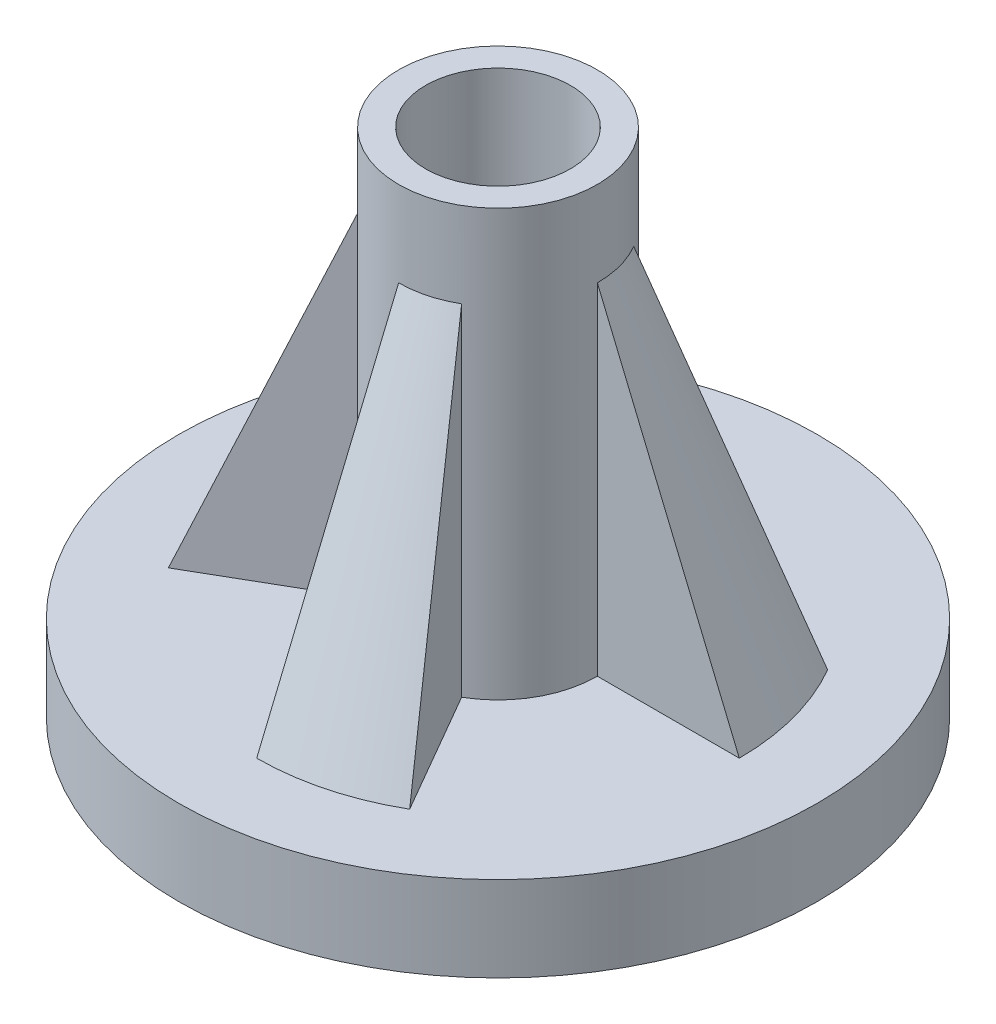
ISO-10303-21;
HEADER;
FILE_DESCRIPTION(('STEP AP214'),'2;1');
FILE_NAME('part.step','',(''),(''),'','','');
FILE_SCHEMA(('AUTOMOTIVE_DESIGN { 1 0 10303 214 1 1 1 1 }'));
ENDSEC;
DATA;
#1=APPLICATION_CONTEXT('core data for automotive mechanical design processes');
#2=APPLICATION_PROTOCOL_DEFINITION('international standard','automotive_design',2000,#1);
#3=PRODUCT_CONTEXT('',#1,'mechanical');
#4=PRODUCT('Part','Part','',(#3));
#5=PRODUCT_RELATED_PRODUCT_CATEGORY('part','',(#4));
#6=PRODUCT_DEFINITION_FORMATION('','',#4);
#7=PRODUCT_DEFINITION_CONTEXT('part definition',#1,'design');
#8=PRODUCT_DEFINITION('design','',#6,#7);
#9=PRODUCT_DEFINITION_SHAPE('','',#8);
#10=(LENGTH_UNIT() NAMED_UNIT(*) SI_UNIT(.MILLI.,.METRE.));
#11=(NAMED_UNIT(*) PLANE_ANGLE_UNIT() SI_UNIT($,.RADIAN.));
#12=(NAMED_UNIT(*) SI_UNIT($,.STERADIAN.) SOLID_ANGLE_UNIT());
#13=UNCERTAINTY_MEASURE_WITH_UNIT(LENGTH_MEASURE(1.E-05),#10,'distance_accuracy_value','');
#14=(GEOMETRIC_REPRESENTATION_CONTEXT(3) GLOBAL_UNCERTAINTY_ASSIGNED_CONTEXT((#13)) GLOBAL_UNIT_ASSIGNED_CONTEXT((#10,
#11,#12)) REPRESENTATION_CONTEXT('',''));
#15=CARTESIAN_POINT('',(0.,0.,0.));
#16=DIRECTION('',(0.,0.,1.));
#17=DIRECTION('',(1.,0.,0.));
#18=AXIS2_PLACEMENT_3D('',#15,#16,#17);
#19=CARTESIAN_POINT('',(0.,4.8,0.));
#20=DIRECTION('',(0.,1.,0.));
#21=DIRECTION('',(0.,0.,1.));
#22=AXIS2_PLACEMENT_3D('',#19,#20,#21);
#23=PLANE('',#22);
#24=CARTESIAN_POINT('',(0.,4.8,0.));
#25=DIRECTION('',(0.,1.,0.));
#26=DIRECTION('',(0.,0.,1.));
#27=AXIS2_PLACEMENT_3D('',#24,#25,#26);
#28=CIRCLE('',#27,11.25);
#29=CARTESIAN_POINT('',(0.,4.8,11.25));
#30=VERTEX_POINT('',#29);
#31=EDGE_CURVE('E55',#30,#30,#28,.T.);
#32=ORIENTED_EDGE('',*,*,#31,.T.);
#33=EDGE_LOOP('',(#32));
#34=FACE_BOUND('',#33,.T.);
#35=CARTESIAN_POINT('',(0.,4.8,0.));
#36=DIRECTION('',(0.,1.,0.));
#37=DIRECTION('',(0.,0.,1.));
#38=AXIS2_PLACEMENT_3D('',#35,#36,#37);
#39=CIRCLE('',#38,3.5);
#40=CARTESIAN_POINT('',(3.03108891324553,4.8,-1.75));
#41=VERTEX_POINT('',#40);
#42=CARTESIAN_POINT('',(0.,4.8,-3.5));
#43=VERTEX_POINT('',#42);
#44=EDGE_CURVE('E160',#41,#43,#39,.T.);
#45=ORIENTED_EDGE('',*,*,#44,.F.);
#46=DIRECTION('',(0.866025403784438,0.,-0.500000000000001));
#47=VECTOR('',#46,1.);
#48=CARTESIAN_POINT('',(3.03108891324553,4.8,-1.75));
#49=LINE('',#48,#47);
#50=CARTESIAN_POINT('',(7.36121593216772,4.8,-4.25000000000001));
#51=VERTEX_POINT('',#50);
#52=EDGE_CURVE('E394',#41,#51,#49,.T.);
#53=ORIENTED_EDGE('',*,*,#52,.T.);
#54=CARTESIAN_POINT('',(0.,4.8,0.));
#55=DIRECTION('',(0.,-1.,0.));
#56=DIRECTION('',(0.,0.,-1.));
#57=AXIS2_PLACEMENT_3D('',#54,#55,#56);
#58=CIRCLE('',#57,8.5);
#59=CARTESIAN_POINT('',(8.5,4.8,0.));
#60=VERTEX_POINT('',#59);
#61=EDGE_CURVE('E153',#51,#60,#58,.T.);
#62=ORIENTED_EDGE('',*,*,#61,.T.);
#63=DIRECTION('',(1.,0.,0.));
#64=VECTOR('',#63,1.);
#65=CARTESIAN_POINT('',(3.5,4.8,0.));
#66=LINE('',#65,#64);
#67=CARTESIAN_POINT('',(3.5,4.8,0.));
#68=VERTEX_POINT('',#67);
#69=EDGE_CURVE('E138',#68,#60,#66,.T.);
#70=ORIENTED_EDGE('',*,*,#69,.F.);
#71=CARTESIAN_POINT('',(1.75,4.8,3.03108891324553));
#72=VERTEX_POINT('',#71);
#73=EDGE_CURVE('E150',#72,#68,#39,.T.);
#74=ORIENTED_EDGE('',*,*,#73,.F.);
#75=DIRECTION('',(-0.500000000000001,0.,-0.866025403784438));
#76=VECTOR('',#75,1.);
#77=CARTESIAN_POINT('',(0.,4.8,0.));
#78=LINE('',#77,#76);
#79=CARTESIAN_POINT('',(4.25000000000001,4.8,7.36121593216772));
#80=VERTEX_POINT('',#79);
#81=EDGE_CURVE('E444',#80,#72,#78,.T.);
#82=ORIENTED_EDGE('',*,*,#81,.F.);
#83=CARTESIAN_POINT('',(0.,4.8,0.));
#84=DIRECTION('',(0.,-1.,0.));
#85=DIRECTION('',(0.,0.,-1.));
#86=AXIS2_PLACEMENT_3D('',#83,#84,#85);
#87=CIRCLE('',#86,8.5);
#88=CARTESIAN_POINT('',(0.,4.8,8.5));
#89=VERTEX_POINT('',#88);
#90=EDGE_CURVE('E449',#80,#89,#87,.T.);
#91=ORIENTED_EDGE('',*,*,#90,.T.);
#92=DIRECTION('',(0.,0.,-1.));
#93=VECTOR('',#92,1.);
#94=CARTESIAN_POINT('',(0.,4.8,0.));
#95=LINE('',#94,#93);
#96=CARTESIAN_POINT('',(0.,4.8,3.5));
#97=VERTEX_POINT('',#96);
#98=EDGE_CURVE('E399',#89,#97,#95,.T.);
#99=ORIENTED_EDGE('',*,*,#98,.T.);
#100=CARTESIAN_POINT('',(-3.03108891324553,4.8,1.75));
#101=VERTEX_POINT('',#100);
#102=EDGE_CURVE('E163',#101,#97,#39,.T.);
#103=ORIENTED_EDGE('',*,*,#102,.F.);
#104=DIRECTION('',(0.866025403784438,0.,-0.500000000000001));
#105=VECTOR('',#104,1.);
#106=CARTESIAN_POINT('',(-3.03108891324553,4.8,1.75));
#107=LINE('',#106,#105);
#108=CARTESIAN_POINT('',(-7.36121593216772,4.8,4.25000000000001));
#109=VERTEX_POINT('',#108);
#110=EDGE_CURVE('E62',#109,#101,#107,.T.);
#111=ORIENTED_EDGE('',*,*,#110,.F.);
#112=CARTESIAN_POINT('',(0.,4.8,0.));
#113=DIRECTION('',(0.,-1.,0.));
#114=DIRECTION('',(0.,0.,-1.));
#115=AXIS2_PLACEMENT_3D('',#112,#113,#114);
#116=CIRCLE('',#115,8.5);
#117=CARTESIAN_POINT('',(-8.5,4.8,0.));
#118=VERTEX_POINT('',#117);
#119=EDGE_CURVE('E66',#109,#118,#116,.T.);
#120=ORIENTED_EDGE('',*,*,#119,.T.);
#121=DIRECTION('',(1.,0.,0.));
#122=VECTOR('',#121,1.);
#123=CARTESIAN_POINT('',(-3.5,4.8,0.));
#124=LINE('',#123,#122);
#125=CARTESIAN_POINT('',(-3.5,4.8,0.));
#126=VERTEX_POINT('',#125);
#127=EDGE_CURVE('E403',#118,#126,#124,.T.);
#128=ORIENTED_EDGE('',*,*,#127,.T.);
#129=CARTESIAN_POINT('',(-1.75,4.8,-3.03108891324553));
#130=VERTEX_POINT('',#129);
#131=EDGE_CURVE('E162',#130,#126,#39,.T.);
#132=ORIENTED_EDGE('',*,*,#131,.F.);
#133=DIRECTION('',(0.500000000000001,0.,0.866025403784438));
#134=VECTOR('',#133,1.);
#135=CARTESIAN_POINT('',(0.,4.8,0.));
#136=LINE('',#135,#134);
#137=CARTESIAN_POINT('',(-4.25000000000001,4.8,-7.36121593216772));
#138=VERTEX_POINT('',#137);
#139=EDGE_CURVE('E431',#138,#130,#136,.T.);
#140=ORIENTED_EDGE('',*,*,#139,.F.);
#141=CARTESIAN_POINT('',(0.,4.8,0.));
#142=DIRECTION('',(0.,-1.,0.));
#143=DIRECTION('',(0.,0.,-1.));
#144=AXIS2_PLACEMENT_3D('',#141,#142,#143);
#145=CIRCLE('',#144,8.5);
#146=CARTESIAN_POINT('',(0.,4.8,-8.5));
#147=VERTEX_POINT('',#146);
#148=EDGE_CURVE('E172',#138,#147,#145,.T.);
#149=ORIENTED_EDGE('',*,*,#148,.T.);
#150=DIRECTION('',(0.,0.,1.));
#151=VECTOR('',#150,1.);
#152=CARTESIAN_POINT('',(0.,4.8,0.));
#153=LINE('',#152,#151);
#154=EDGE_CURVE('E423',#147,#43,#153,.T.);
#155=ORIENTED_EDGE('',*,*,#154,.T.);
#156=EDGE_LOOP('',(#45,#53,#62,#70,#74,#82,#91,#99,#103,#111,#120,#128,#132,#140,#149,#155));
#157=FACE_BOUND('',#156,.T.);
#158=ADVANCED_FACE('F46',(#34,#157),#23,.T.);
#159=CARTESIAN_POINT('',(0.,19.8,0.));
#160=DIRECTION('',(0.,-1.,0.));
#161=DIRECTION('',(0.,0.,-1.));
#162=AXIS2_PLACEMENT_3D('',#159,#160,#161);
#163=CYLINDRICAL_SURFACE('',#162,3.5);
#164=CARTESIAN_POINT('',(0.,19.8,0.));
#165=DIRECTION('',(0.,1.,0.));
#166=DIRECTION('',(0.,0.,1.));
#167=AXIS2_PLACEMENT_3D('',#164,#165,#166);
#168=CIRCLE('',#167,3.5);
#169=CARTESIAN_POINT('',(0.,19.8,3.5));
#170=VERTEX_POINT('',#169);
#171=EDGE_CURVE('E165',#170,#170,#168,.T.);
#172=ORIENTED_EDGE('',*,*,#171,.F.);
#173=EDGE_LOOP('',(#172));
#174=FACE_BOUND('',#173,.T.);
#175=DIRECTION('',(0.,-1.,0.));
#176=VECTOR('',#175,1.);
#177=CARTESIAN_POINT('',(3.03108891324553,16.8,-1.75));
#178=LINE('',#177,#176);
#179=CARTESIAN_POINT('',(3.03108891324553,16.8,-1.75));
#180=VERTEX_POINT('',#179);
#181=EDGE_CURVE('E391',#180,#41,#178,.T.);
#182=ORIENTED_EDGE('',*,*,#181,.T.);
#183=ORIENTED_EDGE('',*,*,#44,.T.);
#184=DIRECTION('',(0.,1.,0.));
#185=VECTOR('',#184,1.);
#186=CARTESIAN_POINT('',(0.,0.,-3.5));
#187=LINE('',#186,#185);
#188=CARTESIAN_POINT('',(0.,16.8,-3.5));
#189=VERTEX_POINT('',#188);
#190=EDGE_CURVE('E420',#43,#189,#187,.T.);
#191=ORIENTED_EDGE('',*,*,#190,.T.);
#192=CARTESIAN_POINT('',(0.,16.8,0.));
#193=DIRECTION('',(0.,-1.,0.));
#194=DIRECTION('',(0.,0.,-1.));
#195=AXIS2_PLACEMENT_3D('',#192,#193,#194);
#196=CIRCLE('',#195,3.5);
#197=CARTESIAN_POINT('',(-1.75,16.8,-3.03108891324553));
#198=VERTEX_POINT('',#197);
#199=EDGE_CURVE('E177',#198,#189,#196,.T.);
#200=ORIENTED_EDGE('',*,*,#199,.F.);
#201=DIRECTION('',(0.,1.,0.));
#202=VECTOR('',#201,1.);
#203=CARTESIAN_POINT('',(-1.75,0.,-3.03108891324553));
#204=LINE('',#203,#202);
#205=EDGE_CURVE('E429',#130,#198,#204,.T.);
#206=ORIENTED_EDGE('',*,*,#205,.F.);
#207=ORIENTED_EDGE('',*,*,#131,.T.);
#208=DIRECTION('',(0.,1.,0.));
#209=VECTOR('',#208,1.);
#210=CARTESIAN_POINT('',(-3.5,16.8,0.));
#211=LINE('',#210,#209);
#212=CARTESIAN_POINT('',(-3.5,16.8,0.));
#213=VERTEX_POINT('',#212);
#214=EDGE_CURVE('E405',#126,#213,#211,.T.);
#215=ORIENTED_EDGE('',*,*,#214,.T.);
#216=CARTESIAN_POINT('',(0.,16.8,0.));
#217=DIRECTION('',(0.,-1.,0.));
#218=DIRECTION('',(0.,0.,-1.));
#219=AXIS2_PLACEMENT_3D('',#216,#217,#218);
#220=CIRCLE('',#219,3.5);
#221=CARTESIAN_POINT('',(-3.03108891324553,16.8,1.75));
#222=VERTEX_POINT('',#221);
#223=EDGE_CURVE('E145',#222,#213,#220,.T.);
#224=ORIENTED_EDGE('',*,*,#223,.F.);
#225=DIRECTION('',(0.,1.,0.));
#226=VECTOR('',#225,1.);
#227=CARTESIAN_POINT('',(-3.03108891324553,16.8,1.75));
#228=LINE('',#227,#226);
#229=EDGE_CURVE('E411',#101,#222,#228,.T.);
#230=ORIENTED_EDGE('',*,*,#229,.F.);
#231=ORIENTED_EDGE('',*,*,#102,.T.);
#232=DIRECTION('',(0.,1.,0.));
#233=VECTOR('',#232,1.);
#234=CARTESIAN_POINT('',(0.,0.,3.5));
#235=LINE('',#234,#233);
#236=CARTESIAN_POINT('',(0.,16.8,3.5));
#237=VERTEX_POINT('',#236);
#238=EDGE_CURVE('E439',#97,#237,#235,.T.);
#239=ORIENTED_EDGE('',*,*,#238,.T.);
#240=CARTESIAN_POINT('',(0.,16.8,0.));
#241=DIRECTION('',(0.,-1.,0.));
#242=DIRECTION('',(0.,0.,-1.));
#243=AXIS2_PLACEMENT_3D('',#240,#241,#242);
#244=CIRCLE('',#243,3.5);
#245=CARTESIAN_POINT('',(1.75,16.8,3.03108891324553));
#246=VERTEX_POINT('',#245);
#247=EDGE_CURVE('E180',#246,#237,#244,.T.);
#248=ORIENTED_EDGE('',*,*,#247,.F.);
#249=DIRECTION('',(0.,1.,0.));
#250=VECTOR('',#249,1.);
#251=CARTESIAN_POINT('',(1.75,0.,3.03108891324553));
#252=LINE('',#251,#250);
#253=EDGE_CURVE('E158',#72,#246,#252,.T.);
#254=ORIENTED_EDGE('',*,*,#253,.F.);
#255=ORIENTED_EDGE('',*,*,#73,.T.);
#256=DIRECTION('',(0.,-1.,0.));
#257=VECTOR('',#256,1.);
#258=CARTESIAN_POINT('',(3.5,16.8,0.));
#259=LINE('',#258,#257);
#260=CARTESIAN_POINT('',(3.5,16.8,0.));
#261=VERTEX_POINT('',#260);
#262=EDGE_CURVE('E135',#261,#68,#259,.T.);
#263=ORIENTED_EDGE('',*,*,#262,.F.);
#264=CARTESIAN_POINT('',(0.,16.8,0.));
#265=DIRECTION('',(0.,-1.,0.));
#266=DIRECTION('',(0.,0.,-1.));
#267=AXIS2_PLACEMENT_3D('',#264,#265,#266);
#268=CIRCLE('',#267,3.5);
#269=EDGE_CURVE('E396',#180,#261,#268,.T.);
#270=ORIENTED_EDGE('',*,*,#269,.F.);
#271=EDGE_LOOP('',(#182,#183,#191,#200,#206,#207,#215,#224,#230,#231,#239,#248,#254,#255,#263,#270));
#272=FACE_BOUND('',#271,.T.);
#273=ADVANCED_FACE('F156',(#174,#272),#163,.T.);
#274=CARTESIAN_POINT('',(0.,4.8,0.));
#275=DIRECTION('',(0.,-1.,0.));
#276=DIRECTION('',(0.,0.,-1.));
#277=AXIS2_PLACEMENT_3D('',#274,#275,#276);
#278=CYLINDRICAL_SURFACE('',#277,11.25);
#279=ORIENTED_EDGE('',*,*,#31,.F.);
#280=EDGE_LOOP('',(#279));
#281=FACE_BOUND('',#280,.T.);
#282=CARTESIAN_POINT('',(0.,1.8,0.));
#283=DIRECTION('',(0.,1.,0.));
#284=DIRECTION('',(0.,0.,1.));
#285=AXIS2_PLACEMENT_3D('',#282,#283,#284);
#286=CIRCLE('',#285,11.25);
#287=CARTESIAN_POINT('',(0.,1.8,11.25));
#288=VERTEX_POINT('',#287);
#289=EDGE_CURVE('E183',#288,#288,#286,.T.);
#290=ORIENTED_EDGE('',*,*,#289,.T.);
#291=EDGE_LOOP('',(#290));
#292=FACE_BOUND('',#291,.T.);
#293=ADVANCED_FACE('F48',(#281,#292),#278,.T.);
#294=CARTESIAN_POINT('',(0.,1.8,0.));
#295=DIRECTION('',(0.,1.,0.));
#296=DIRECTION('',(0.,0.,1.));
#297=AXIS2_PLACEMENT_3D('',#294,#295,#296);
#298=PLANE('',#297);
#299=ORIENTED_EDGE('',*,*,#289,.F.);
#300=EDGE_LOOP('',(#299));
#301=FACE_BOUND('',#300,.T.);
#302=CARTESIAN_POINT('',(0.,1.8,0.));
#303=DIRECTION('',(0.,1.,0.));
#304=DIRECTION('',(0.,0.,1.));
#305=AXIS2_PLACEMENT_3D('',#302,#303,#304);
#306=CIRCLE('',#305,1.5);
#307=CARTESIAN_POINT('',(0.,1.8,1.5));
#308=VERTEX_POINT('',#307);
#309=EDGE_CURVE('E50',#308,#308,#306,.F.);
#310=ORIENTED_EDGE('',*,*,#309,.F.);
#311=EDGE_LOOP('',(#310));
#312=FACE_BOUND('',#311,.T.);
#313=ADVANCED_FACE('F195',(#301,#312),#298,.F.);
#314=CARTESIAN_POINT('',(0.,19.8,0.));
#315=DIRECTION('',(0.,-1.,0.));
#316=DIRECTION('',(0.,0.,-1.));
#317=AXIS2_PLACEMENT_3D('',#314,#315,#316);
#318=CYLINDRICAL_SURFACE('',#317,2.55);
#319=CARTESIAN_POINT('',(0.,19.8,0.));
#320=DIRECTION('',(0.,1.,0.));
#321=DIRECTION('',(0.,0.,1.));
#322=AXIS2_PLACEMENT_3D('',#319,#320,#321);
#323=CIRCLE('',#322,2.55);
#324=CARTESIAN_POINT('',(0.,19.8,2.55));
#325=VERTEX_POINT('',#324);
#326=EDGE_CURVE('E159',#325,#325,#323,.T.);
#327=ORIENTED_EDGE('',*,*,#326,.T.);
#328=EDGE_LOOP('',(#327));
#329=FACE_BOUND('',#328,.T.);
#330=CARTESIAN_POINT('',(0.,4.8,0.));
#331=DIRECTION('',(0.,1.,0.));
#332=DIRECTION('',(0.,0.,1.));
#333=AXIS2_PLACEMENT_3D('',#330,#331,#332);
#334=CIRCLE('',#333,2.55);
#335=CARTESIAN_POINT('',(0.,4.8,2.55));
#336=VERTEX_POINT('',#335);
#337=EDGE_CURVE('E11',#336,#336,#334,.F.);
#338=ORIENTED_EDGE('',*,*,#337,.T.);
#339=EDGE_LOOP('',(#338));
#340=FACE_BOUND('',#339,.T.);
#341=ADVANCED_FACE('F200',(#329,#340),#318,.F.);
#342=CARTESIAN_POINT('',(0.,19.8,0.));
#343=DIRECTION('',(0.,1.,0.));
#344=DIRECTION('',(0.,0.,1.));
#345=AXIS2_PLACEMENT_3D('',#342,#343,#344);
#346=PLANE('',#345);
#347=ORIENTED_EDGE('',*,*,#326,.F.);
#348=EDGE_LOOP('',(#347));
#349=FACE_BOUND('',#348,.T.);
#350=ORIENTED_EDGE('',*,*,#171,.T.);
#351=EDGE_LOOP('',(#350));
#352=FACE_BOUND('',#351,.T.);
#353=ADVANCED_FACE('F214',(#349,#352),#346,.T.);
#354=CARTESIAN_POINT('',(0.,4.8,0.));
#355=DIRECTION('',(0.,1.,0.));
#356=DIRECTION('',(0.,0.,1.));
#357=AXIS2_PLACEMENT_3D('',#354,#355,#356);
#358=CIRCLE('',#357,1.5);
#359=CARTESIAN_POINT('',(0.,4.8,1.5));
#360=VERTEX_POINT('',#359);
#361=EDGE_CURVE('E169',#360,#360,#358,.T.);
#362=ORIENTED_EDGE('',*,*,#361,.F.);
#363=EDGE_LOOP('',(#362));
#364=FACE_BOUND('',#363,.T.);
#365=ORIENTED_EDGE('',*,*,#337,.F.);
#366=EDGE_LOOP('',(#365));
#367=FACE_BOUND('',#366,.T.);
#368=ADVANCED_FACE('F207',(#364,#367),#23,.T.);
#369=CARTESIAN_POINT('',(0.,-4.24264068711929,0.));
#370=DIRECTION('',(0.,1.,0.));
#371=DIRECTION('',(0.,0.,1.));
#372=AXIS2_PLACEMENT_3D('',#369,#370,#371);
#373=CYLINDRICAL_SURFACE('',#372,1.5);
#374=ORIENTED_EDGE('',*,*,#309,.T.);
#375=EDGE_LOOP('',(#374));
#376=FACE_BOUND('',#375,.T.);
#377=ORIENTED_EDGE('',*,*,#361,.T.);
#378=EDGE_LOOP('',(#377));
#379=FACE_BOUND('',#378,.T.);
#380=ADVANCED_FACE('F213',(#376,#379),#373,.F.);
#381=CARTESIAN_POINT('',(0.,16.8,0.));
#382=DIRECTION('',(0.,-1.,0.));
#383=DIRECTION('',(0.,0.,-1.));
#384=AXIS2_PLACEMENT_3D('',#381,#382,#383);
#385=CONICAL_SURFACE('',#384,3.5,0.394791119699761);
#386=DIRECTION('',(0.192307692307693,-0.923076923076923,0.333086693763245));
#387=VECTOR('',#386,1.);
#388=CARTESIAN_POINT('',(4.4733727810651,3.72781065088757,7.74810893800042));
#389=LINE('',#388,#387);
#390=EDGE_CURVE('E447',#246,#80,#389,.T.);
#391=ORIENTED_EDGE('',*,*,#390,.F.);
#392=ORIENTED_EDGE('',*,*,#247,.T.);
#393=DIRECTION('',(0.,-0.923076923076923,0.384615384615385));
#394=VECTOR('',#393,1.);
#395=CARTESIAN_POINT('',(0.,3.72781065088757,8.94674556213018));
#396=LINE('',#395,#394);
#397=EDGE_CURVE('E441',#237,#89,#396,.T.);
#398=ORIENTED_EDGE('',*,*,#397,.T.);
#399=ORIENTED_EDGE('',*,*,#90,.F.);
#400=EDGE_LOOP('',(#391,#392,#398,#399));
#401=FACE_BOUND('',#400,.T.);
#402=ADVANCED_FACE('F221',(#401),#385,.T.);
#403=CARTESIAN_POINT('',(0.,0.,0.));
#404=DIRECTION('',(0.866025403784438,0.,-0.500000000000001));
#405=DIRECTION('',(-0.500000000000001,0.,-0.866025403784438));
#406=AXIS2_PLACEMENT_3D('',#403,#404,#405);
#407=PLANE('',#406);
#408=ORIENTED_EDGE('',*,*,#81,.T.);
#409=ORIENTED_EDGE('',*,*,#253,.T.);
#410=ORIENTED_EDGE('',*,*,#390,.T.);
#411=EDGE_LOOP('',(#408,#409,#410));
#412=FACE_BOUND('',#411,.T.);
#413=ADVANCED_FACE('F234',(#412),#407,.T.);
#414=CARTESIAN_POINT('',(0.,0.,0.));
#415=DIRECTION('',(1.,0.,0.));
#416=DIRECTION('',(0.,0.,-1.));
#417=AXIS2_PLACEMENT_3D('',#414,#415,#416);
#418=PLANE('',#417);
#419=ORIENTED_EDGE('',*,*,#98,.F.);
#420=ORIENTED_EDGE('',*,*,#397,.F.);
#421=ORIENTED_EDGE('',*,*,#238,.F.);
#422=EDGE_LOOP('',(#419,#420,#421));
#423=FACE_BOUND('',#422,.T.);
#424=ADVANCED_FACE('F238',(#423),#418,.F.);
#425=CARTESIAN_POINT('',(0.,16.8,0.));
#426=DIRECTION('',(0.,-1.,0.));
#427=DIRECTION('',(0.,0.,-1.));
#428=AXIS2_PLACEMENT_3D('',#425,#426,#427);
#429=CONICAL_SURFACE('',#428,3.5,0.394791119699761);
#430=DIRECTION('',(-0.192307692307693,-0.923076923076923,-0.333086693763245));
#431=VECTOR('',#430,1.);
#432=CARTESIAN_POINT('',(-4.4733727810651,3.72781065088757,-7.74810893800042));
#433=LINE('',#432,#431);
#434=EDGE_CURVE('E433',#198,#138,#433,.T.);
#435=ORIENTED_EDGE('',*,*,#434,.F.);
#436=ORIENTED_EDGE('',*,*,#199,.T.);
#437=DIRECTION('',(0.,-0.923076923076923,-0.384615384615385));
#438=VECTOR('',#437,1.);
#439=CARTESIAN_POINT('',(0.,3.72781065088757,-8.94674556213018));
#440=LINE('',#439,#438);
#441=EDGE_CURVE('E426',#189,#147,#440,.T.);
#442=ORIENTED_EDGE('',*,*,#441,.T.);
#443=ORIENTED_EDGE('',*,*,#148,.F.);
#444=EDGE_LOOP('',(#435,#436,#442,#443));
#445=FACE_BOUND('',#444,.T.);
#446=ADVANCED_FACE('F242',(#445),#429,.T.);
#447=CARTESIAN_POINT('',(0.,0.,0.));
#448=DIRECTION('',(0.866025403784438,0.,-0.500000000000001));
#449=DIRECTION('',(-0.500000000000001,0.,-0.866025403784438));
#450=AXIS2_PLACEMENT_3D('',#447,#448,#449);
#451=PLANE('',#450);
#452=ORIENTED_EDGE('',*,*,#205,.T.);
#453=ORIENTED_EDGE('',*,*,#434,.T.);
#454=ORIENTED_EDGE('',*,*,#139,.T.);
#455=EDGE_LOOP('',(#452,#453,#454));
#456=FACE_BOUND('',#455,.T.);
#457=ADVANCED_FACE('F246',(#456),#451,.F.);
#458=CARTESIAN_POINT('',(0.,0.,0.));
#459=DIRECTION('',(1.,0.,0.));
#460=DIRECTION('',(0.,0.,-1.));
#461=AXIS2_PLACEMENT_3D('',#458,#459,#460);
#462=PLANE('',#461);
#463=ORIENTED_EDGE('',*,*,#190,.F.);
#464=ORIENTED_EDGE('',*,*,#154,.F.);
#465=ORIENTED_EDGE('',*,*,#441,.F.);
#466=EDGE_LOOP('',(#463,#464,#465));
#467=FACE_BOUND('',#466,.T.);
#468=ADVANCED_FACE('F250',(#467),#462,.T.);
#469=CARTESIAN_POINT('',(0.,16.8,0.));
#470=DIRECTION('',(0.,-1.,0.));
#471=DIRECTION('',(0.,0.,-1.));
#472=AXIS2_PLACEMENT_3D('',#469,#470,#471);
#473=CONICAL_SURFACE('',#472,3.5,0.394791119699762);
#474=DIRECTION('',(-0.333086693763245,-0.923076923076923,0.192307692307693));
#475=VECTOR('',#474,1.);
#476=CARTESIAN_POINT('',(-7.36121593216772,4.8,4.25000000000001));
#477=LINE('',#476,#475);
#478=EDGE_CURVE('E414',#222,#109,#477,.T.);
#479=ORIENTED_EDGE('',*,*,#478,.F.);
#480=ORIENTED_EDGE('',*,*,#223,.T.);
#481=DIRECTION('',(-0.384615384615385,-0.923076923076923,0.));
#482=VECTOR('',#481,1.);
#483=CARTESIAN_POINT('',(-8.5,4.8,0.));
#484=LINE('',#483,#482);
#485=EDGE_CURVE('E407',#213,#118,#484,.T.);
#486=ORIENTED_EDGE('',*,*,#485,.T.);
#487=ORIENTED_EDGE('',*,*,#119,.F.);
#488=EDGE_LOOP('',(#479,#480,#486,#487));
#489=FACE_BOUND('',#488,.T.);
#490=ADVANCED_FACE('F253',(#489),#473,.T.);
#491=CARTESIAN_POINT('',(0.,0.,0.));
#492=DIRECTION('',(0.500000000000001,0.,0.866025403784438));
#493=DIRECTION('',(0.866025403784438,0.,-0.500000000000001));
#494=AXIS2_PLACEMENT_3D('',#491,#492,#493);
#495=PLANE('',#494);
#496=ORIENTED_EDGE('',*,*,#110,.T.);
#497=ORIENTED_EDGE('',*,*,#229,.T.);
#498=ORIENTED_EDGE('',*,*,#478,.T.);
#499=EDGE_LOOP('',(#496,#497,#498));
#500=FACE_BOUND('',#499,.T.);
#501=ADVANCED_FACE('F257',(#500),#495,.T.);
#502=CARTESIAN_POINT('',(0.,0.,0.));
#503=DIRECTION('',(0.,0.,1.));
#504=DIRECTION('',(1.,0.,0.));
#505=AXIS2_PLACEMENT_3D('',#502,#503,#504);
#506=PLANE('',#505);
#507=ORIENTED_EDGE('',*,*,#127,.F.);
#508=ORIENTED_EDGE('',*,*,#485,.F.);
#509=ORIENTED_EDGE('',*,*,#214,.F.);
#510=EDGE_LOOP('',(#507,#508,#509));
#511=FACE_BOUND('',#510,.T.);
#512=ADVANCED_FACE('F261',(#511),#506,.F.);
#513=CARTESIAN_POINT('',(0.,4.8,0.));
#514=DIRECTION('',(0.,-1.,0.));
#515=DIRECTION('',(0.,0.,-1.));
#516=AXIS2_PLACEMENT_3D('',#513,#514,#515);
#517=CONICAL_SURFACE('',#516,8.5,0.394791119699762);
#518=DIRECTION('',(-0.333086693763245,0.923076923076923,0.192307692307693));
#519=VECTOR('',#518,1.);
#520=CARTESIAN_POINT('',(7.36121593216772,4.8,-4.25000000000001));
#521=LINE('',#520,#519);
#522=EDGE_CURVE('E393',#51,#180,#521,.T.);
#523=ORIENTED_EDGE('',*,*,#522,.T.);
#524=ORIENTED_EDGE('',*,*,#269,.T.);
#525=DIRECTION('',(-0.384615384615385,0.923076923076923,0.));
#526=VECTOR('',#525,1.);
#527=CARTESIAN_POINT('',(8.5,4.8,0.));
#528=LINE('',#527,#526);
#529=EDGE_CURVE('E140',#60,#261,#528,.T.);
#530=ORIENTED_EDGE('',*,*,#529,.F.);
#531=ORIENTED_EDGE('',*,*,#61,.F.);
#532=EDGE_LOOP('',(#523,#524,#530,#531));
#533=FACE_BOUND('',#532,.T.);
#534=ADVANCED_FACE('F265',(#533),#517,.T.);
#535=CARTESIAN_POINT('',(0.,0.,0.));
#536=DIRECTION('',(0.500000000000001,0.,0.866025403784438));
#537=DIRECTION('',(0.866025403784438,0.,-0.500000000000001));
#538=AXIS2_PLACEMENT_3D('',#535,#536,#537);
#539=PLANE('',#538);
#540=ORIENTED_EDGE('',*,*,#181,.F.);
#541=ORIENTED_EDGE('',*,*,#522,.F.);
#542=ORIENTED_EDGE('',*,*,#52,.F.);
#543=EDGE_LOOP('',(#540,#541,#542));
#544=FACE_BOUND('',#543,.T.);
#545=ADVANCED_FACE('F269',(#544),#539,.F.);
#546=CARTESIAN_POINT('',(0.,0.,0.));
#547=DIRECTION('',(0.,0.,1.));
#548=DIRECTION('',(1.,0.,0.));
#549=AXIS2_PLACEMENT_3D('',#546,#547,#548);
#550=PLANE('',#549);
#551=ORIENTED_EDGE('',*,*,#262,.T.);
#552=ORIENTED_EDGE('',*,*,#69,.T.);
#553=ORIENTED_EDGE('',*,*,#529,.T.);
#554=EDGE_LOOP('',(#551,#552,#553));
#555=FACE_BOUND('',#554,.T.);
#556=ADVANCED_FACE('F137',(#555),#550,.T.);
#557=CLOSED_SHELL('',(#158,#273,#293,#313,#341,#353,#368,#380,#402,#413,#424,#446,#457,#468,
#490,#501,#512,#534,#545,#556));
#558=MANIFOLD_SOLID_BREP('B2',#557);
#559=ADVANCED_BREP_SHAPE_REPRESENTATION('',(#18,#558),#14);
#560=SHAPE_DEFINITION_REPRESENTATION(#9,#559);
ENDSEC;
END-ISO-10303-21;
